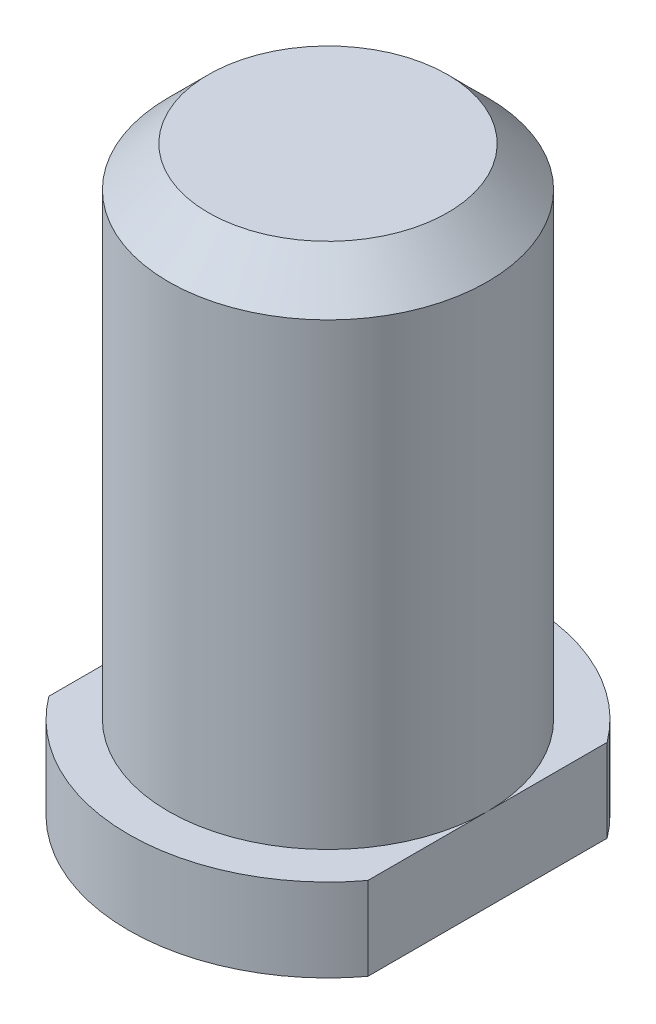
ISO-10303-21;
HEADER;
FILE_DESCRIPTION(('STEP AP214'),'2;1');
FILE_NAME('part.step','',(''),(''),'','','');
FILE_SCHEMA(('AUTOMOTIVE_DESIGN { 1 0 10303 214 1 1 1 1 }'));
ENDSEC;
DATA;
#1=APPLICATION_CONTEXT('core data for automotive mechanical design processes');
#2=APPLICATION_PROTOCOL_DEFINITION('international standard','automotive_design',2000,#1);
#3=PRODUCT_CONTEXT('',#1,'mechanical');
#4=PRODUCT('Part','Part','',(#3));
#5=PRODUCT_RELATED_PRODUCT_CATEGORY('part','',(#4));
#6=PRODUCT_DEFINITION_FORMATION('','',#4);
#7=PRODUCT_DEFINITION_CONTEXT('part definition',#1,'design');
#8=PRODUCT_DEFINITION('design','',#6,#7);
#9=PRODUCT_DEFINITION_SHAPE('','',#8);
#10=(LENGTH_UNIT() NAMED_UNIT(*) SI_UNIT(.MILLI.,.METRE.));
#11=(NAMED_UNIT(*) PLANE_ANGLE_UNIT() SI_UNIT($,.RADIAN.));
#12=(NAMED_UNIT(*) SI_UNIT($,.STERADIAN.) SOLID_ANGLE_UNIT());
#13=UNCERTAINTY_MEASURE_WITH_UNIT(LENGTH_MEASURE(1.E-05),#10,'distance_accuracy_value','');
#14=(GEOMETRIC_REPRESENTATION_CONTEXT(3) GLOBAL_UNCERTAINTY_ASSIGNED_CONTEXT((#13)) GLOBAL_UNIT_ASSIGNED_CONTEXT((#10,
#11,#12)) REPRESENTATION_CONTEXT('',''));
#15=CARTESIAN_POINT('',(0.,0.,0.));
#16=DIRECTION('',(0.,0.,1.));
#17=DIRECTION('',(1.,0.,0.));
#18=AXIS2_PLACEMENT_3D('',#15,#16,#17);
#19=CARTESIAN_POINT('',(0.,-1.5875,0.));
#20=DIRECTION('',(0.,1.,0.));
#21=DIRECTION('',(0.,0.,1.));
#22=AXIS2_PLACEMENT_3D('',#19,#20,#21);
#23=CYLINDRICAL_SURFACE('',#22,3.81);
#24=CARTESIAN_POINT('',(0.,-1.5875,0.));
#25=DIRECTION('',(0.,-1.,0.));
#26=DIRECTION('',(0.,0.,-1.));
#27=AXIS2_PLACEMENT_3D('',#24,#25,#26);
#28=CIRCLE('',#27,3.81);
#29=CARTESIAN_POINT('',(-3.048,-1.5875,-2.286));
#30=VERTEX_POINT('',#29);
#31=CARTESIAN_POINT('',(3.048,-1.5875,-2.286));
#32=VERTEX_POINT('',#31);
#33=EDGE_CURVE('E165',#30,#32,#28,.T.);
#34=ORIENTED_EDGE('',*,*,#33,.F.);
#35=DIRECTION('',(0.,1.,0.));
#36=VECTOR('',#35,1.);
#37=CARTESIAN_POINT('',(-3.048,-1.5875,-2.286));
#38=LINE('',#37,#36);
#39=CARTESIAN_POINT('',(-3.048,0.,-2.286));
#40=VERTEX_POINT('',#39);
#41=EDGE_CURVE('E169',#30,#40,#38,.T.);
#42=ORIENTED_EDGE('',*,*,#41,.T.);
#43=CARTESIAN_POINT('',(0.,0.,0.));
#44=DIRECTION('',(0.,-1.,0.));
#45=DIRECTION('',(0.,0.,-1.));
#46=AXIS2_PLACEMENT_3D('',#43,#44,#45);
#47=CIRCLE('',#46,3.81);
#48=CARTESIAN_POINT('',(3.048,0.,-2.286));
#49=VERTEX_POINT('',#48);
#50=EDGE_CURVE('E124',#40,#49,#47,.T.);
#51=ORIENTED_EDGE('',*,*,#50,.T.);
#52=DIRECTION('',(0.,1.,0.));
#53=VECTOR('',#52,1.);
#54=CARTESIAN_POINT('',(3.048,-1.5875,-2.286));
#55=LINE('',#54,#53);
#56=EDGE_CURVE('E69',#49,#32,#55,.F.);
#57=ORIENTED_EDGE('',*,*,#56,.T.);
#58=EDGE_LOOP('',(#34,#42,#51,#57));
#59=FACE_BOUND('',#58,.T.);
#60=ADVANCED_FACE('F44',(#59),#23,.T.);
#61=CARTESIAN_POINT('',(0.,0.,0.));
#62=DIRECTION('',(0.,-1.,0.));
#63=DIRECTION('',(0.,0.,-1.));
#64=AXIS2_PLACEMENT_3D('',#61,#62,#63);
#65=PLANE('',#64);
#66=ORIENTED_EDGE('',*,*,#50,.F.);
#67=DIRECTION('',(0.,0.,1.));
#68=VECTOR('',#67,1.);
#69=CARTESIAN_POINT('',(-3.048,0.,0.));
#70=LINE('',#69,#68);
#71=CARTESIAN_POINT('',(-3.048,0.,0.));
#72=VERTEX_POINT('',#71);
#73=EDGE_CURVE('E11',#40,#72,#70,.T.);
#74=ORIENTED_EDGE('',*,*,#73,.T.);
#75=CARTESIAN_POINT('',(0.,0.,0.));
#76=DIRECTION('',(0.,1.,0.));
#77=DIRECTION('',(0.,0.,1.));
#78=AXIS2_PLACEMENT_3D('',#75,#76,#77);
#79=CIRCLE('',#78,3.048);
#80=CARTESIAN_POINT('',(3.048,0.,0.));
#81=VERTEX_POINT('',#80);
#82=EDGE_CURVE('E113',#81,#72,#79,.T.);
#83=ORIENTED_EDGE('',*,*,#82,.F.);
#84=DIRECTION('',(0.,0.,-1.));
#85=VECTOR('',#84,1.);
#86=CARTESIAN_POINT('',(3.048,0.,0.));
#87=LINE('',#86,#85);
#88=EDGE_CURVE('E90',#81,#49,#87,.T.);
#89=ORIENTED_EDGE('',*,*,#88,.T.);
#90=EDGE_LOOP('',(#66,#74,#83,#89));
#91=FACE_BOUND('',#90,.T.);
#92=ADVANCED_FACE('F117',(#91),#65,.F.);
#93=CARTESIAN_POINT('',(0.,9.525,0.));
#94=DIRECTION('',(0.,-1.,0.));
#95=DIRECTION('',(0.,0.,-1.));
#96=AXIS2_PLACEMENT_3D('',#93,#94,#95);
#97=CYLINDRICAL_SURFACE('',#96,3.048);
#98=CARTESIAN_POINT('',(0.,8.763,0.));
#99=DIRECTION('',(0.,1.,0.));
#100=DIRECTION('',(0.,0.,1.));
#101=AXIS2_PLACEMENT_3D('',#98,#99,#100);
#102=CIRCLE('',#101,3.048);
#103=CARTESIAN_POINT('',(0.,8.763,3.048));
#104=VERTEX_POINT('',#103);
#105=EDGE_CURVE('E100',#104,#104,#102,.F.);
#106=ORIENTED_EDGE('',*,*,#105,.T.);
#107=EDGE_LOOP('',(#106));
#108=FACE_BOUND('',#107,.T.);
#109=ORIENTED_EDGE('',*,*,#82,.T.);
#110=EDGE_CURVE('E106',#72,#81,#79,.T.);
#111=ORIENTED_EDGE('',*,*,#110,.T.);
#112=EDGE_LOOP('',(#109,#111));
#113=FACE_BOUND('',#112,.T.);
#114=ADVANCED_FACE('F112',(#108,#113),#97,.T.);
#115=CARTESIAN_POINT('',(0.,9.525,0.));
#116=DIRECTION('',(0.,1.,0.));
#117=DIRECTION('',(0.,0.,1.));
#118=AXIS2_PLACEMENT_3D('',#115,#116,#117);
#119=PLANE('',#118);
#120=CARTESIAN_POINT('',(0.,9.525,0.));
#121=DIRECTION('',(0.,1.,0.));
#122=DIRECTION('',(0.,0.,1.));
#123=AXIS2_PLACEMENT_3D('',#120,#121,#122);
#124=CIRCLE('',#123,2.286);
#125=CARTESIAN_POINT('',(0.,9.525,2.286));
#126=VERTEX_POINT('',#125);
#127=EDGE_CURVE('E119',#126,#126,#124,.T.);
#128=ORIENTED_EDGE('',*,*,#127,.T.);
#129=EDGE_LOOP('',(#128));
#130=FACE_BOUND('',#129,.T.);
#131=ADVANCED_FACE('F135',(#130),#119,.T.);
#132=CARTESIAN_POINT('',(0.,9.525,0.));
#133=DIRECTION('',(0.,-1.,0.));
#134=DIRECTION('',(0.,0.,-1.));
#135=AXIS2_PLACEMENT_3D('',#132,#133,#134);
#136=CONICAL_SURFACE('',#135,2.286,0.785398163397447);
#137=ORIENTED_EDGE('',*,*,#105,.F.);
#138=EDGE_LOOP('',(#137));
#139=FACE_BOUND('',#138,.T.);
#140=ORIENTED_EDGE('',*,*,#127,.F.);
#141=EDGE_LOOP('',(#140));
#142=FACE_BOUND('',#141,.T.);
#143=ADVANCED_FACE('F47',(#139,#142),#136,.T.);
#144=CARTESIAN_POINT('',(3.048,0.,2.286));
#145=VERTEX_POINT('',#144);
#146=CARTESIAN_POINT('',(-3.048,0.,2.286));
#147=VERTEX_POINT('',#146);
#148=EDGE_CURVE('E109',#145,#147,#47,.T.);
#149=ORIENTED_EDGE('',*,*,#148,.T.);
#150=DIRECTION('',(0.,1.,0.));
#151=VECTOR('',#150,1.);
#152=CARTESIAN_POINT('',(-3.048,-1.5875,2.286));
#153=LINE('',#152,#151);
#154=CARTESIAN_POINT('',(-3.048,-1.5875,2.286));
#155=VERTEX_POINT('',#154);
#156=EDGE_CURVE('E61',#147,#155,#153,.F.);
#157=ORIENTED_EDGE('',*,*,#156,.T.);
#158=CARTESIAN_POINT('',(3.048,-1.5875,2.286));
#159=VERTEX_POINT('',#158);
#160=EDGE_CURVE('E115',#159,#155,#28,.T.);
#161=ORIENTED_EDGE('',*,*,#160,.F.);
#162=DIRECTION('',(0.,1.,0.));
#163=VECTOR('',#162,1.);
#164=CARTESIAN_POINT('',(3.048,-1.5875,2.286));
#165=LINE('',#164,#163);
#166=EDGE_CURVE('E163',#159,#145,#165,.T.);
#167=ORIENTED_EDGE('',*,*,#166,.T.);
#168=EDGE_LOOP('',(#149,#157,#161,#167));
#169=FACE_BOUND('',#168,.T.);
#170=ADVANCED_FACE('F134',(#169),#23,.T.);
#171=CARTESIAN_POINT('',(0.,-1.5875,0.));
#172=DIRECTION('',(0.,-1.,0.));
#173=DIRECTION('',(0.,0.,-1.));
#174=AXIS2_PLACEMENT_3D('',#171,#172,#173);
#175=PLANE('',#174);
#176=DIRECTION('',(0.,0.,-1.));
#177=VECTOR('',#176,1.);
#178=CARTESIAN_POINT('',(-3.048,-1.5875,4.63460534412953));
#179=LINE('',#178,#177);
#180=EDGE_CURVE('E180',#155,#30,#179,.T.);
#181=ORIENTED_EDGE('',*,*,#180,.T.);
#182=ORIENTED_EDGE('',*,*,#33,.T.);
#183=DIRECTION('',(0.,0.,1.));
#184=VECTOR('',#183,1.);
#185=CARTESIAN_POINT('',(3.048,-1.5875,4.22919255060726));
#186=LINE('',#185,#184);
#187=EDGE_CURVE('E181',#32,#159,#186,.T.);
#188=ORIENTED_EDGE('',*,*,#187,.T.);
#189=ORIENTED_EDGE('',*,*,#160,.T.);
#190=EDGE_LOOP('',(#181,#182,#188,#189));
#191=FACE_BOUND('',#190,.T.);
#192=ADVANCED_FACE('F154',(#191),#175,.T.);
#193=ORIENTED_EDGE('',*,*,#110,.F.);
#194=EDGE_CURVE('E49',#72,#147,#70,.T.);
#195=ORIENTED_EDGE('',*,*,#194,.T.);
#196=ORIENTED_EDGE('',*,*,#148,.F.);
#197=EDGE_CURVE('E93',#145,#81,#87,.T.);
#198=ORIENTED_EDGE('',*,*,#197,.T.);
#199=EDGE_LOOP('',(#193,#195,#196,#198));
#200=FACE_BOUND('',#199,.T.);
#201=ADVANCED_FACE('F105',(#200),#65,.F.);
#202=CARTESIAN_POINT('',(3.048,-1.5875,4.22919255060726));
#203=DIRECTION('',(-1.,0.,0.));
#204=DIRECTION('',(0.,0.,1.));
#205=AXIS2_PLACEMENT_3D('',#202,#203,#204);
#206=PLANE('',#205);
#207=ORIENTED_EDGE('',*,*,#187,.F.);
#208=ORIENTED_EDGE('',*,*,#56,.F.);
#209=ORIENTED_EDGE('',*,*,#88,.F.);
#210=ORIENTED_EDGE('',*,*,#197,.F.);
#211=ORIENTED_EDGE('',*,*,#166,.F.);
#212=EDGE_LOOP('',(#207,#208,#209,#210,#211));
#213=FACE_BOUND('',#212,.T.);
#214=ADVANCED_FACE('F92',(#213),#206,.F.);
#215=CARTESIAN_POINT('',(-3.048,-1.5875,4.63460534412953));
#216=DIRECTION('',(1.,0.,0.));
#217=DIRECTION('',(0.,0.,-1.));
#218=AXIS2_PLACEMENT_3D('',#215,#216,#217);
#219=PLANE('',#218);
#220=ORIENTED_EDGE('',*,*,#180,.F.);
#221=ORIENTED_EDGE('',*,*,#156,.F.);
#222=ORIENTED_EDGE('',*,*,#194,.F.);
#223=ORIENTED_EDGE('',*,*,#73,.F.);
#224=ORIENTED_EDGE('',*,*,#41,.F.);
#225=EDGE_LOOP('',(#220,#221,#222,#223,#224));
#226=FACE_BOUND('',#225,.T.);
#227=ADVANCED_FACE('F187',(#226),#219,.F.);
#228=CLOSED_SHELL('',(#60,#92,#114,#131,#143,#170,#192,#201,#214,#227));
#229=MANIFOLD_SOLID_BREP('B2',#228);
#230=ADVANCED_BREP_SHAPE_REPRESENTATION('',(#18,#229),#14);
#231=SHAPE_DEFINITION_REPRESENTATION(#9,#230);
ENDSEC;
END-ISO-10303-21;
